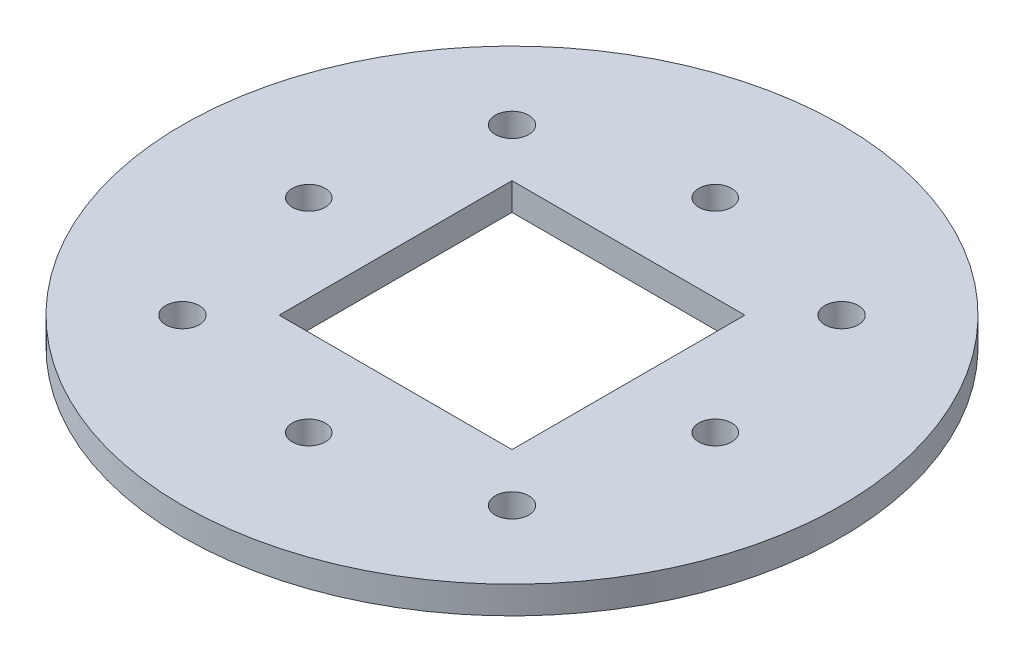
ISO-10303-21;
HEADER;
FILE_DESCRIPTION(('STEP AP214'),'2;1');
FILE_NAME('part.step','',(''),(''),'','','');
FILE_SCHEMA(('AUTOMOTIVE_DESIGN { 1 0 10303 214 1 1 1 1 }'));
ENDSEC;
DATA;
#1=APPLICATION_CONTEXT('core data for automotive mechanical design processes');
#2=APPLICATION_PROTOCOL_DEFINITION('international standard','automotive_design',2000,#1);
#3=PRODUCT_CONTEXT('',#1,'mechanical');
#4=PRODUCT('Part','Part','',(#3));
#5=PRODUCT_RELATED_PRODUCT_CATEGORY('part','',(#4));
#6=PRODUCT_DEFINITION_FORMATION('','',#4);
#7=PRODUCT_DEFINITION_CONTEXT('part definition',#1,'design');
#8=PRODUCT_DEFINITION('design','',#6,#7);
#9=PRODUCT_DEFINITION_SHAPE('','',#8);
#10=(LENGTH_UNIT() NAMED_UNIT(*) SI_UNIT(.MILLI.,.METRE.));
#11=(NAMED_UNIT(*) PLANE_ANGLE_UNIT() SI_UNIT($,.RADIAN.));
#12=(NAMED_UNIT(*) SI_UNIT($,.STERADIAN.) SOLID_ANGLE_UNIT());
#13=UNCERTAINTY_MEASURE_WITH_UNIT(LENGTH_MEASURE(1.E-05),#10,'distance_accuracy_value','');
#14=(GEOMETRIC_REPRESENTATION_CONTEXT(3) GLOBAL_UNCERTAINTY_ASSIGNED_CONTEXT((#13)) GLOBAL_UNIT_ASSIGNED_CONTEXT((#10,
#11,#12)) REPRESENTATION_CONTEXT('',''));
#15=CARTESIAN_POINT('',(0.,0.,0.));
#16=DIRECTION('',(0.,0.,1.));
#17=DIRECTION('',(1.,0.,0.));
#18=AXIS2_PLACEMENT_3D('',#15,#16,#17);
#19=CARTESIAN_POINT('',(0.,0.,0.));
#20=DIRECTION('',(0.,1.,0.));
#21=DIRECTION('',(0.,0.,1.));
#22=AXIS2_PLACEMENT_3D('',#19,#20,#21);
#23=PLANE('',#22);
#24=CARTESIAN_POINT('',(0.,0.,0.));
#25=DIRECTION('',(0.,1.,0.));
#26=DIRECTION('',(0.,0.,1.));
#27=AXIS2_PLACEMENT_3D('',#24,#25,#26);
#28=CIRCLE('',#27,60.);
#29=CARTESIAN_POINT('',(0.,0.,60.));
#30=VERTEX_POINT('',#29);
#31=EDGE_CURVE('E56',#30,#30,#28,.T.);
#32=ORIENTED_EDGE('',*,*,#31,.F.);
#33=EDGE_LOOP('',(#32));
#34=FACE_BOUND('',#33,.T.);
#35=DIRECTION('',(0.,0.,1.));
#36=VECTOR('',#35,1.);
#37=CARTESIAN_POINT('',(-21.2,0.,0.));
#38=LINE('',#37,#36);
#39=CARTESIAN_POINT('',(-21.2,0.,-21.2));
#40=VERTEX_POINT('',#39);
#41=CARTESIAN_POINT('',(-21.2,0.,21.2));
#42=VERTEX_POINT('',#41);
#43=EDGE_CURVE('E114',#40,#42,#38,.T.);
#44=ORIENTED_EDGE('',*,*,#43,.T.);
#45=DIRECTION('',(1.,0.,0.));
#46=VECTOR('',#45,1.);
#47=CARTESIAN_POINT('',(0.,0.,21.2));
#48=LINE('',#47,#46);
#49=CARTESIAN_POINT('',(21.2,0.,21.2));
#50=VERTEX_POINT('',#49);
#51=EDGE_CURVE('E94',#42,#50,#48,.T.);
#52=ORIENTED_EDGE('',*,*,#51,.T.);
#53=DIRECTION('',(0.,0.,-1.));
#54=VECTOR('',#53,1.);
#55=CARTESIAN_POINT('',(21.2,0.,0.));
#56=LINE('',#55,#54);
#57=CARTESIAN_POINT('',(21.2,0.,-21.2));
#58=VERTEX_POINT('',#57);
#59=EDGE_CURVE('E105',#50,#58,#56,.T.);
#60=ORIENTED_EDGE('',*,*,#59,.T.);
#61=DIRECTION('',(-1.,0.,0.));
#62=VECTOR('',#61,1.);
#63=CARTESIAN_POINT('',(0.,0.,-21.2));
#64=LINE('',#63,#62);
#65=EDGE_CURVE('E110',#58,#40,#64,.T.);
#66=ORIENTED_EDGE('',*,*,#65,.T.);
#67=EDGE_LOOP('',(#44,#52,#60,#66));
#68=FACE_BOUND('',#67,.T.);
#69=CARTESIAN_POINT('',(0.,0.,-37.));
#70=DIRECTION('',(0.,1.,0.));
#71=DIRECTION('',(0.,0.,1.));
#72=AXIS2_PLACEMENT_3D('',#69,#70,#71);
#73=CIRCLE('',#72,3.);
#74=CARTESIAN_POINT('',(0.,0.,-34.));
#75=VERTEX_POINT('',#74);
#76=EDGE_CURVE('E127',#75,#75,#73,.T.);
#77=ORIENTED_EDGE('',*,*,#76,.T.);
#78=EDGE_LOOP('',(#77));
#79=FACE_BOUND('',#78,.T.);
#80=CARTESIAN_POINT('',(-37.,0.,0.));
#81=DIRECTION('',(0.,1.,0.));
#82=DIRECTION('',(0.,0.,1.));
#83=AXIS2_PLACEMENT_3D('',#80,#81,#82);
#84=CIRCLE('',#83,3.);
#85=CARTESIAN_POINT('',(-37.,0.,3.));
#86=VERTEX_POINT('',#85);
#87=EDGE_CURVE('E391',#86,#86,#84,.T.);
#88=ORIENTED_EDGE('',*,*,#87,.T.);
#89=EDGE_LOOP('',(#88));
#90=FACE_BOUND('',#89,.T.);
#91=CARTESIAN_POINT('',(37.,0.,0.));
#92=DIRECTION('',(0.,1.,0.));
#93=DIRECTION('',(0.,0.,1.));
#94=AXIS2_PLACEMENT_3D('',#91,#92,#93);
#95=CIRCLE('',#94,3.);
#96=CARTESIAN_POINT('',(37.,0.,3.));
#97=VERTEX_POINT('',#96);
#98=EDGE_CURVE('E397',#97,#97,#95,.T.);
#99=ORIENTED_EDGE('',*,*,#98,.T.);
#100=EDGE_LOOP('',(#99));
#101=FACE_BOUND('',#100,.T.);
#102=CARTESIAN_POINT('',(0.,0.,37.));
#103=DIRECTION('',(0.,1.,0.));
#104=DIRECTION('',(0.,0.,1.));
#105=AXIS2_PLACEMENT_3D('',#102,#103,#104);
#106=CIRCLE('',#105,3.);
#107=CARTESIAN_POINT('',(0.,0.,40.));
#108=VERTEX_POINT('',#107);
#109=EDGE_CURVE('E403',#108,#108,#106,.T.);
#110=ORIENTED_EDGE('',*,*,#109,.T.);
#111=EDGE_LOOP('',(#110));
#112=FACE_BOUND('',#111,.T.);
#113=CARTESIAN_POINT('',(30.,0.,-30.));
#114=DIRECTION('',(0.,1.,0.));
#115=DIRECTION('',(0.,0.,1.));
#116=AXIS2_PLACEMENT_3D('',#113,#114,#115);
#117=CIRCLE('',#116,3.05);
#118=CARTESIAN_POINT('',(30.,0.,-26.95));
#119=VERTEX_POINT('',#118);
#120=EDGE_CURVE('E407',#119,#119,#117,.T.);
#121=ORIENTED_EDGE('',*,*,#120,.T.);
#122=EDGE_LOOP('',(#121));
#123=FACE_BOUND('',#122,.T.);
#124=CARTESIAN_POINT('',(30.,0.,30.));
#125=DIRECTION('',(0.,1.,0.));
#126=DIRECTION('',(0.,0.,1.));
#127=AXIS2_PLACEMENT_3D('',#124,#125,#126);
#128=CIRCLE('',#127,3.05);
#129=CARTESIAN_POINT('',(30.,0.,33.05));
#130=VERTEX_POINT('',#129);
#131=EDGE_CURVE('E411',#130,#130,#128,.T.);
#132=ORIENTED_EDGE('',*,*,#131,.T.);
#133=EDGE_LOOP('',(#132));
#134=FACE_BOUND('',#133,.T.);
#135=CARTESIAN_POINT('',(-30.,0.,30.));
#136=DIRECTION('',(0.,1.,0.));
#137=DIRECTION('',(0.,0.,1.));
#138=AXIS2_PLACEMENT_3D('',#135,#136,#137);
#139=CIRCLE('',#138,3.05);
#140=CARTESIAN_POINT('',(-30.,0.,33.05));
#141=VERTEX_POINT('',#140);
#142=EDGE_CURVE('E143',#141,#141,#139,.T.);
#143=ORIENTED_EDGE('',*,*,#142,.T.);
#144=EDGE_LOOP('',(#143));
#145=FACE_BOUND('',#144,.T.);
#146=CARTESIAN_POINT('',(-30.,0.,-30.));
#147=DIRECTION('',(0.,1.,0.));
#148=DIRECTION('',(0.,0.,1.));
#149=AXIS2_PLACEMENT_3D('',#146,#147,#148);
#150=CIRCLE('',#149,3.05);
#151=CARTESIAN_POINT('',(-30.,0.,-26.95));
#152=VERTEX_POINT('',#151);
#153=EDGE_CURVE('E102',#152,#152,#150,.T.);
#154=ORIENTED_EDGE('',*,*,#153,.T.);
#155=EDGE_LOOP('',(#154));
#156=FACE_BOUND('',#155,.T.);
#157=ADVANCED_FACE('F47',(#34,#68,#79,#90,#101,#112,#123,#134,#145,#156),#23,.F.);
#158=CARTESIAN_POINT('',(0.,5.,0.));
#159=DIRECTION('',(0.,1.,0.));
#160=DIRECTION('',(0.,0.,1.));
#161=AXIS2_PLACEMENT_3D('',#158,#159,#160);
#162=PLANE('',#161);
#163=CARTESIAN_POINT('',(0.,5.,0.));
#164=DIRECTION('',(0.,1.,0.));
#165=DIRECTION('',(0.,0.,1.));
#166=AXIS2_PLACEMENT_3D('',#163,#164,#165);
#167=CIRCLE('',#166,60.);
#168=CARTESIAN_POINT('',(0.,5.,60.));
#169=VERTEX_POINT('',#168);
#170=EDGE_CURVE('E11',#169,#169,#167,.T.);
#171=ORIENTED_EDGE('',*,*,#170,.T.);
#172=EDGE_LOOP('',(#171));
#173=FACE_BOUND('',#172,.T.);
#174=DIRECTION('',(0.,0.,-1.));
#175=VECTOR('',#174,1.);
#176=CARTESIAN_POINT('',(21.2,5.,-21.2));
#177=LINE('',#176,#175);
#178=CARTESIAN_POINT('',(21.2,5.,21.2));
#179=VERTEX_POINT('',#178);
#180=CARTESIAN_POINT('',(21.2,5.,-21.2));
#181=VERTEX_POINT('',#180);
#182=EDGE_CURVE('E116',#179,#181,#177,.T.);
#183=ORIENTED_EDGE('',*,*,#182,.F.);
#184=DIRECTION('',(1.,0.,0.));
#185=VECTOR('',#184,1.);
#186=CARTESIAN_POINT('',(-21.2,5.,21.2));
#187=LINE('',#186,#185);
#188=CARTESIAN_POINT('',(-21.2,5.,21.2));
#189=VERTEX_POINT('',#188);
#190=EDGE_CURVE('E96',#189,#179,#187,.T.);
#191=ORIENTED_EDGE('',*,*,#190,.F.);
#192=DIRECTION('',(0.,0.,1.));
#193=VECTOR('',#192,1.);
#194=CARTESIAN_POINT('',(-21.2,5.,-21.2));
#195=LINE('',#194,#193);
#196=CARTESIAN_POINT('',(-21.2,5.,-21.2));
#197=VERTEX_POINT('',#196);
#198=EDGE_CURVE('E420',#197,#189,#195,.T.);
#199=ORIENTED_EDGE('',*,*,#198,.F.);
#200=DIRECTION('',(-1.,0.,0.));
#201=VECTOR('',#200,1.);
#202=CARTESIAN_POINT('',(-21.2,5.,-21.2));
#203=LINE('',#202,#201);
#204=EDGE_CURVE('E148',#181,#197,#203,.T.);
#205=ORIENTED_EDGE('',*,*,#204,.F.);
#206=EDGE_LOOP('',(#183,#191,#199,#205));
#207=FACE_BOUND('',#206,.T.);
#208=CARTESIAN_POINT('',(0.,5.,-37.));
#209=DIRECTION('',(0.,1.,0.));
#210=DIRECTION('',(0.,0.,1.));
#211=AXIS2_PLACEMENT_3D('',#208,#209,#210);
#212=CIRCLE('',#211,3.);
#213=CARTESIAN_POINT('',(0.,5.,-34.));
#214=VERTEX_POINT('',#213);
#215=EDGE_CURVE('E144',#214,#214,#212,.T.);
#216=ORIENTED_EDGE('',*,*,#215,.F.);
#217=EDGE_LOOP('',(#216));
#218=FACE_BOUND('',#217,.T.);
#219=CARTESIAN_POINT('',(-37.,5.,0.));
#220=DIRECTION('',(0.,1.,0.));
#221=DIRECTION('',(0.,0.,1.));
#222=AXIS2_PLACEMENT_3D('',#219,#220,#221);
#223=CIRCLE('',#222,3.);
#224=CARTESIAN_POINT('',(-37.,5.,3.));
#225=VERTEX_POINT('',#224);
#226=EDGE_CURVE('E149',#225,#225,#223,.T.);
#227=ORIENTED_EDGE('',*,*,#226,.F.);
#228=EDGE_LOOP('',(#227));
#229=FACE_BOUND('',#228,.T.);
#230=CARTESIAN_POINT('',(37.,5.,0.));
#231=DIRECTION('',(0.,1.,0.));
#232=DIRECTION('',(0.,0.,1.));
#233=AXIS2_PLACEMENT_3D('',#230,#231,#232);
#234=CIRCLE('',#233,3.);
#235=CARTESIAN_POINT('',(37.,5.,3.));
#236=VERTEX_POINT('',#235);
#237=EDGE_CURVE('E153',#236,#236,#234,.T.);
#238=ORIENTED_EDGE('',*,*,#237,.F.);
#239=EDGE_LOOP('',(#238));
#240=FACE_BOUND('',#239,.T.);
#241=CARTESIAN_POINT('',(0.,5.,37.));
#242=DIRECTION('',(0.,1.,0.));
#243=DIRECTION('',(0.,0.,1.));
#244=AXIS2_PLACEMENT_3D('',#241,#242,#243);
#245=CIRCLE('',#244,3.);
#246=CARTESIAN_POINT('',(0.,5.,40.));
#247=VERTEX_POINT('',#246);
#248=EDGE_CURVE('E157',#247,#247,#245,.T.);
#249=ORIENTED_EDGE('',*,*,#248,.F.);
#250=EDGE_LOOP('',(#249));
#251=FACE_BOUND('',#250,.T.);
#252=CARTESIAN_POINT('',(30.,5.,-30.));
#253=DIRECTION('',(0.,1.,0.));
#254=DIRECTION('',(0.,0.,-1.));
#255=AXIS2_PLACEMENT_3D('',#252,#253,#254);
#256=CIRCLE('',#255,3.05);
#257=CARTESIAN_POINT('',(30.,5.,-33.05));
#258=VERTEX_POINT('',#257);
#259=EDGE_CURVE('E161',#258,#258,#256,.T.);
#260=ORIENTED_EDGE('',*,*,#259,.F.);
#261=EDGE_LOOP('',(#260));
#262=FACE_BOUND('',#261,.T.);
#263=CARTESIAN_POINT('',(30.,5.,30.));
#264=DIRECTION('',(0.,1.,0.));
#265=DIRECTION('',(0.,0.,1.));
#266=AXIS2_PLACEMENT_3D('',#263,#264,#265);
#267=CIRCLE('',#266,3.05);
#268=CARTESIAN_POINT('',(30.,5.,33.05));
#269=VERTEX_POINT('',#268);
#270=EDGE_CURVE('E165',#269,#269,#267,.T.);
#271=ORIENTED_EDGE('',*,*,#270,.F.);
#272=EDGE_LOOP('',(#271));
#273=FACE_BOUND('',#272,.T.);
#274=CARTESIAN_POINT('',(-30.,5.,30.));
#275=DIRECTION('',(0.,1.,0.));
#276=DIRECTION('',(0.,0.,-1.));
#277=AXIS2_PLACEMENT_3D('',#274,#275,#276);
#278=CIRCLE('',#277,3.05);
#279=CARTESIAN_POINT('',(-30.,5.,26.95));
#280=VERTEX_POINT('',#279);
#281=EDGE_CURVE('E139',#280,#280,#278,.T.);
#282=ORIENTED_EDGE('',*,*,#281,.F.);
#283=EDGE_LOOP('',(#282));
#284=FACE_BOUND('',#283,.T.);
#285=CARTESIAN_POINT('',(-30.,5.,-30.));
#286=DIRECTION('',(0.,1.,0.));
#287=DIRECTION('',(0.,0.,1.));
#288=AXIS2_PLACEMENT_3D('',#285,#286,#287);
#289=CIRCLE('',#288,3.05);
#290=CARTESIAN_POINT('',(-30.,5.,-26.95));
#291=VERTEX_POINT('',#290);
#292=EDGE_CURVE('E135',#291,#291,#289,.T.);
#293=ORIENTED_EDGE('',*,*,#292,.F.);
#294=EDGE_LOOP('',(#293));
#295=FACE_BOUND('',#294,.T.);
#296=ADVANCED_FACE('F49',(#173,#207,#218,#229,#240,#251,#262,#273,#284,#295),#162,.T.);
#297=CARTESIAN_POINT('',(0.,174.705627484771,0.));
#298=DIRECTION('',(0.,-1.,0.));
#299=DIRECTION('',(0.,0.,-1.));
#300=AXIS2_PLACEMENT_3D('',#297,#298,#299);
#301=CYLINDRICAL_SURFACE('',#300,60.);
#302=ORIENTED_EDGE('',*,*,#170,.F.);
#303=EDGE_LOOP('',(#302));
#304=FACE_BOUND('',#303,.T.);
#305=ORIENTED_EDGE('',*,*,#31,.T.);
#306=EDGE_LOOP('',(#305));
#307=FACE_BOUND('',#306,.T.);
#308=ADVANCED_FACE('F177',(#304,#307),#301,.T.);
#309=CARTESIAN_POINT('',(-21.2,-5.,-21.2));
#310=DIRECTION('',(0.,0.,-1.));
#311=DIRECTION('',(-1.,0.,0.));
#312=AXIS2_PLACEMENT_3D('',#309,#310,#311);
#313=PLANE('',#312);
#314=DIRECTION('',(0.,1.,0.));
#315=VECTOR('',#314,1.);
#316=CARTESIAN_POINT('',(21.2,-5.,-21.2));
#317=LINE('',#316,#315);
#318=EDGE_CURVE('E63',#58,#181,#317,.T.);
#319=ORIENTED_EDGE('',*,*,#318,.T.);
#320=ORIENTED_EDGE('',*,*,#204,.T.);
#321=DIRECTION('',(0.,1.,0.));
#322=VECTOR('',#321,1.);
#323=CARTESIAN_POINT('',(-21.2,-5.,-21.2));
#324=LINE('',#323,#322);
#325=EDGE_CURVE('E71',#40,#197,#324,.T.);
#326=ORIENTED_EDGE('',*,*,#325,.F.);
#327=ORIENTED_EDGE('',*,*,#65,.F.);
#328=EDGE_LOOP('',(#319,#320,#326,#327));
#329=FACE_BOUND('',#328,.T.);
#330=ADVANCED_FACE('F187',(#329),#313,.F.);
#331=CARTESIAN_POINT('',(21.2,-5.,-21.2));
#332=DIRECTION('',(1.,0.,0.));
#333=DIRECTION('',(0.,0.,-1.));
#334=AXIS2_PLACEMENT_3D('',#331,#332,#333);
#335=PLANE('',#334);
#336=DIRECTION('',(0.,1.,0.));
#337=VECTOR('',#336,1.);
#338=CARTESIAN_POINT('',(21.2,-5.,21.2));
#339=LINE('',#338,#337);
#340=EDGE_CURVE('E90',#50,#179,#339,.T.);
#341=ORIENTED_EDGE('',*,*,#340,.T.);
#342=ORIENTED_EDGE('',*,*,#182,.T.);
#343=ORIENTED_EDGE('',*,*,#318,.F.);
#344=ORIENTED_EDGE('',*,*,#59,.F.);
#345=EDGE_LOOP('',(#341,#342,#343,#344));
#346=FACE_BOUND('',#345,.T.);
#347=ADVANCED_FACE('F106',(#346),#335,.F.);
#348=CARTESIAN_POINT('',(-21.2,-5.,-21.2));
#349=DIRECTION('',(-1.,0.,0.));
#350=DIRECTION('',(0.,0.,1.));
#351=AXIS2_PLACEMENT_3D('',#348,#349,#350);
#352=PLANE('',#351);
#353=ORIENTED_EDGE('',*,*,#325,.T.);
#354=ORIENTED_EDGE('',*,*,#198,.T.);
#355=DIRECTION('',(0.,1.,0.));
#356=VECTOR('',#355,1.);
#357=CARTESIAN_POINT('',(-21.2,-5.,21.2));
#358=LINE('',#357,#356);
#359=EDGE_CURVE('E101',#42,#189,#358,.T.);
#360=ORIENTED_EDGE('',*,*,#359,.F.);
#361=ORIENTED_EDGE('',*,*,#43,.F.);
#362=EDGE_LOOP('',(#353,#354,#360,#361));
#363=FACE_BOUND('',#362,.T.);
#364=ADVANCED_FACE('F218',(#363),#352,.F.);
#365=CARTESIAN_POINT('',(-21.2,-5.,21.2));
#366=DIRECTION('',(0.,0.,1.));
#367=DIRECTION('',(1.,0.,0.));
#368=AXIS2_PLACEMENT_3D('',#365,#366,#367);
#369=PLANE('',#368);
#370=ORIENTED_EDGE('',*,*,#359,.T.);
#371=ORIENTED_EDGE('',*,*,#190,.T.);
#372=ORIENTED_EDGE('',*,*,#340,.F.);
#373=ORIENTED_EDGE('',*,*,#51,.F.);
#374=EDGE_LOOP('',(#370,#371,#372,#373));
#375=FACE_BOUND('',#374,.T.);
#376=ADVANCED_FACE('F92',(#375),#369,.F.);
#377=CARTESIAN_POINT('',(0.,-5.,-37.));
#378=DIRECTION('',(0.,1.,0.));
#379=DIRECTION('',(0.,0.,1.));
#380=AXIS2_PLACEMENT_3D('',#377,#378,#379);
#381=CYLINDRICAL_SURFACE('',#380,3.);
#382=ORIENTED_EDGE('',*,*,#76,.F.);
#383=EDGE_LOOP('',(#382));
#384=FACE_BOUND('',#383,.T.);
#385=ORIENTED_EDGE('',*,*,#215,.T.);
#386=EDGE_LOOP('',(#385));
#387=FACE_BOUND('',#386,.T.);
#388=ADVANCED_FACE('F213',(#384,#387),#381,.F.);
#389=CARTESIAN_POINT('',(-37.,-5.,0.));
#390=DIRECTION('',(0.,1.,0.));
#391=DIRECTION('',(0.,0.,1.));
#392=AXIS2_PLACEMENT_3D('',#389,#390,#391);
#393=CYLINDRICAL_SURFACE('',#392,3.);
#394=ORIENTED_EDGE('',*,*,#87,.F.);
#395=EDGE_LOOP('',(#394));
#396=FACE_BOUND('',#395,.T.);
#397=ORIENTED_EDGE('',*,*,#226,.T.);
#398=EDGE_LOOP('',(#397));
#399=FACE_BOUND('',#398,.T.);
#400=ADVANCED_FACE('F209',(#396,#399),#393,.F.);
#401=CARTESIAN_POINT('',(37.,-5.,0.));
#402=DIRECTION('',(0.,1.,0.));
#403=DIRECTION('',(0.,0.,1.));
#404=AXIS2_PLACEMENT_3D('',#401,#402,#403);
#405=CYLINDRICAL_SURFACE('',#404,3.);
#406=ORIENTED_EDGE('',*,*,#98,.F.);
#407=EDGE_LOOP('',(#406));
#408=FACE_BOUND('',#407,.T.);
#409=ORIENTED_EDGE('',*,*,#237,.T.);
#410=EDGE_LOOP('',(#409));
#411=FACE_BOUND('',#410,.T.);
#412=ADVANCED_FACE('F205',(#408,#411),#405,.F.);
#413=CARTESIAN_POINT('',(0.,-5.,37.));
#414=DIRECTION('',(0.,1.,0.));
#415=DIRECTION('',(0.,0.,1.));
#416=AXIS2_PLACEMENT_3D('',#413,#414,#415);
#417=CYLINDRICAL_SURFACE('',#416,3.);
#418=ORIENTED_EDGE('',*,*,#109,.F.);
#419=EDGE_LOOP('',(#418));
#420=FACE_BOUND('',#419,.T.);
#421=ORIENTED_EDGE('',*,*,#248,.T.);
#422=EDGE_LOOP('',(#421));
#423=FACE_BOUND('',#422,.T.);
#424=ADVANCED_FACE('F201',(#420,#423),#417,.F.);
#425=CARTESIAN_POINT('',(30.,-5.,-30.));
#426=DIRECTION('',(0.,1.,0.));
#427=DIRECTION('',(0.,0.,1.));
#428=AXIS2_PLACEMENT_3D('',#425,#426,#427);
#429=CYLINDRICAL_SURFACE('',#428,3.05);
#430=ORIENTED_EDGE('',*,*,#120,.F.);
#431=EDGE_LOOP('',(#430));
#432=FACE_BOUND('',#431,.T.);
#433=ORIENTED_EDGE('',*,*,#259,.T.);
#434=EDGE_LOOP('',(#433));
#435=FACE_BOUND('',#434,.T.);
#436=ADVANCED_FACE('F197',(#432,#435),#429,.F.);
#437=CARTESIAN_POINT('',(30.,-5.,30.));
#438=DIRECTION('',(0.,1.,0.));
#439=DIRECTION('',(0.,0.,1.));
#440=AXIS2_PLACEMENT_3D('',#437,#438,#439);
#441=CYLINDRICAL_SURFACE('',#440,3.05);
#442=ORIENTED_EDGE('',*,*,#131,.F.);
#443=EDGE_LOOP('',(#442));
#444=FACE_BOUND('',#443,.T.);
#445=ORIENTED_EDGE('',*,*,#270,.T.);
#446=EDGE_LOOP('',(#445));
#447=FACE_BOUND('',#446,.T.);
#448=ADVANCED_FACE('F193',(#444,#447),#441,.F.);
#449=CARTESIAN_POINT('',(-30.,-5.,30.));
#450=DIRECTION('',(0.,1.,0.));
#451=DIRECTION('',(0.,0.,1.));
#452=AXIS2_PLACEMENT_3D('',#449,#450,#451);
#453=CYLINDRICAL_SURFACE('',#452,3.05);
#454=ORIENTED_EDGE('',*,*,#142,.F.);
#455=EDGE_LOOP('',(#454));
#456=FACE_BOUND('',#455,.T.);
#457=ORIENTED_EDGE('',*,*,#281,.T.);
#458=EDGE_LOOP('',(#457));
#459=FACE_BOUND('',#458,.T.);
#460=ADVANCED_FACE('F190',(#456,#459),#453,.F.);
#461=CARTESIAN_POINT('',(-30.,-5.,-30.));
#462=DIRECTION('',(0.,1.,0.));
#463=DIRECTION('',(0.,0.,1.));
#464=AXIS2_PLACEMENT_3D('',#461,#462,#463);
#465=CYLINDRICAL_SURFACE('',#464,3.05);
#466=ORIENTED_EDGE('',*,*,#153,.F.);
#467=EDGE_LOOP('',(#466));
#468=FACE_BOUND('',#467,.T.);
#469=ORIENTED_EDGE('',*,*,#292,.T.);
#470=EDGE_LOOP('',(#469));
#471=FACE_BOUND('',#470,.T.);
#472=ADVANCED_FACE('F189',(#468,#471),#465,.F.);
#473=CLOSED_SHELL('',(#157,#296,#308,#330,#347,#364,#376,#388,#400,#412,#424,#436,#448,#460,#472));
#474=MANIFOLD_SOLID_BREP('B2',#473);
#475=ADVANCED_BREP_SHAPE_REPRESENTATION('',(#18,#474),#14);
#476=SHAPE_DEFINITION_REPRESENTATION(#9,#475);
ENDSEC;
END-ISO-10303-21;
